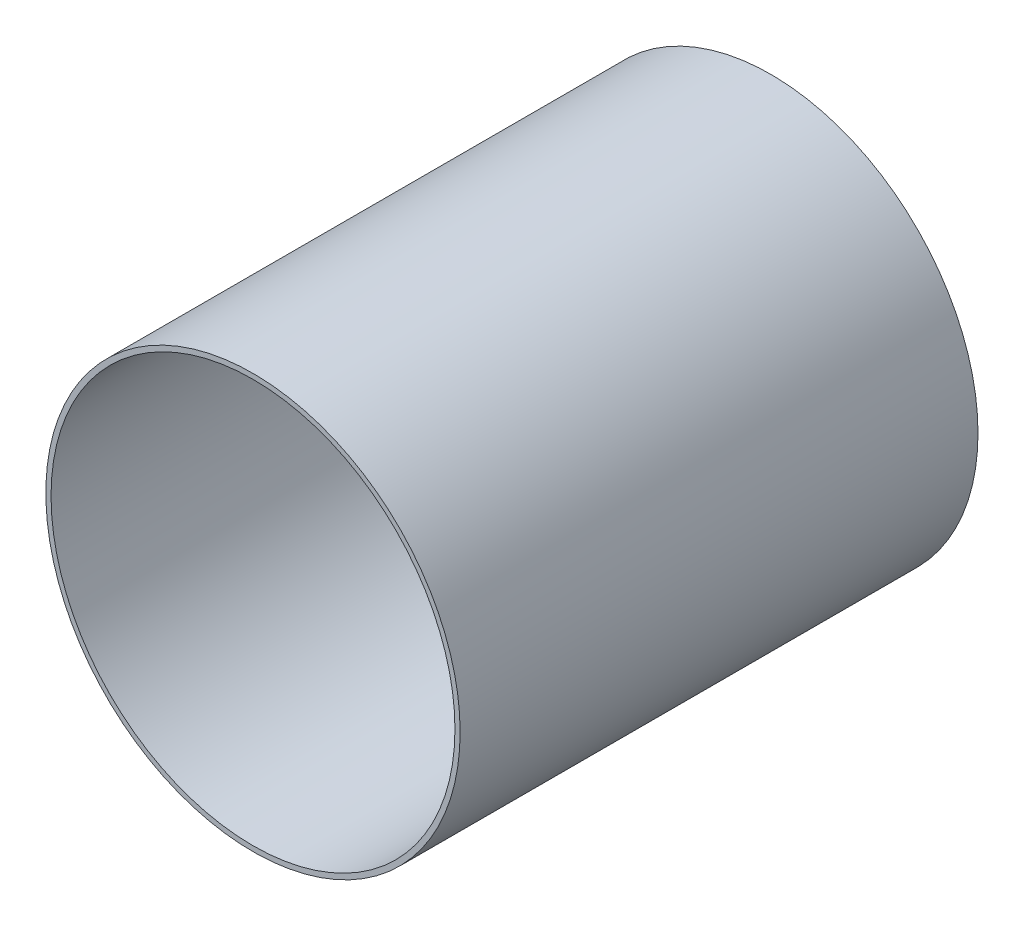
ISO-10303-21;
HEADER;
FILE_DESCRIPTION(('STEP AP214'),'2;1');
FILE_NAME('part.step','',(''),(''),'','','');
FILE_SCHEMA(('AUTOMOTIVE_DESIGN { 1 0 10303 214 1 1 1 1 }'));
ENDSEC;
DATA;
#1=APPLICATION_CONTEXT('core data for automotive mechanical design processes');
#2=APPLICATION_PROTOCOL_DEFINITION('international standard','automotive_design',2000,#1);
#3=PRODUCT_CONTEXT('',#1,'mechanical');
#4=PRODUCT('Part','Part','',(#3));
#5=PRODUCT_RELATED_PRODUCT_CATEGORY('part','',(#4));
#6=PRODUCT_DEFINITION_FORMATION('','',#4);
#7=PRODUCT_DEFINITION_CONTEXT('part definition',#1,'design');
#8=PRODUCT_DEFINITION('design','',#6,#7);
#9=PRODUCT_DEFINITION_SHAPE('','',#8);
#10=(LENGTH_UNIT() NAMED_UNIT(*) SI_UNIT(.MILLI.,.METRE.));
#11=(NAMED_UNIT(*) PLANE_ANGLE_UNIT() SI_UNIT($,.RADIAN.));
#12=(NAMED_UNIT(*) SI_UNIT($,.STERADIAN.) SOLID_ANGLE_UNIT());
#13=UNCERTAINTY_MEASURE_WITH_UNIT(LENGTH_MEASURE(1.E-05),#10,'distance_accuracy_value','');
#14=(GEOMETRIC_REPRESENTATION_CONTEXT(3) GLOBAL_UNCERTAINTY_ASSIGNED_CONTEXT((#13)) GLOBAL_UNIT_ASSIGNED_CONTEXT((#10,
#11,#12)) REPRESENTATION_CONTEXT('',''));
#15=CARTESIAN_POINT('',(0.,0.,0.));
#16=DIRECTION('',(0.,0.,1.));
#17=DIRECTION('',(1.,0.,0.));
#18=AXIS2_PLACEMENT_3D('',#15,#16,#17);
#19=CARTESIAN_POINT('',(0.,0.,254.));
#20=DIRECTION('',(0.,0.,-1.));
#21=DIRECTION('',(-1.,0.,0.));
#22=AXIS2_PLACEMENT_3D('',#19,#20,#21);
#23=CYLINDRICAL_SURFACE('',#22,101.6);
#24=CARTESIAN_POINT('',(0.,0.,254.));
#25=DIRECTION('',(0.,0.,1.));
#26=DIRECTION('',(1.,0.,0.));
#27=AXIS2_PLACEMENT_3D('',#24,#25,#26);
#28=CIRCLE('',#27,101.6);
#29=CARTESIAN_POINT('',(101.6,0.,254.));
#30=VERTEX_POINT('',#29);
#31=EDGE_CURVE('E10',#30,#30,#28,.T.);
#32=ORIENTED_EDGE('',*,*,#31,.F.);
#33=EDGE_LOOP('',(#32));
#34=FACE_BOUND('',#33,.T.);
#35=CARTESIAN_POINT('',(0.,0.,0.));
#36=DIRECTION('',(0.,0.,1.));
#37=DIRECTION('',(1.,0.,0.));
#38=AXIS2_PLACEMENT_3D('',#35,#36,#37);
#39=CIRCLE('',#38,101.6);
#40=CARTESIAN_POINT('',(101.6,0.,0.));
#41=VERTEX_POINT('',#40);
#42=EDGE_CURVE('E33',#41,#41,#39,.T.);
#43=ORIENTED_EDGE('',*,*,#42,.T.);
#44=EDGE_LOOP('',(#43));
#45=FACE_BOUND('',#44,.T.);
#46=ADVANCED_FACE('F30',(#34,#45),#23,.T.);
#47=CARTESIAN_POINT('',(0.,0.,254.));
#48=DIRECTION('',(0.,0.,1.));
#49=DIRECTION('',(1.,0.,0.));
#50=AXIS2_PLACEMENT_3D('',#47,#48,#49);
#51=PLANE('',#50);
#52=CARTESIAN_POINT('',(0.,0.,254.));
#53=DIRECTION('',(0.,0.,1.));
#54=DIRECTION('',(1.,0.,0.));
#55=AXIS2_PLACEMENT_3D('',#52,#53,#54);
#56=CIRCLE('',#55,99.06);
#57=CARTESIAN_POINT('',(99.06,0.,254.));
#58=VERTEX_POINT('',#57);
#59=EDGE_CURVE('E40',#58,#58,#56,.T.);
#60=ORIENTED_EDGE('',*,*,#59,.F.);
#61=EDGE_LOOP('',(#60));
#62=FACE_BOUND('',#61,.T.);
#63=ORIENTED_EDGE('',*,*,#31,.T.);
#64=EDGE_LOOP('',(#63));
#65=FACE_BOUND('',#64,.T.);
#66=ADVANCED_FACE('F71',(#62,#65),#51,.T.);
#67=CARTESIAN_POINT('',(0.,0.,0.));
#68=DIRECTION('',(0.,0.,1.));
#69=DIRECTION('',(1.,0.,0.));
#70=AXIS2_PLACEMENT_3D('',#67,#68,#69);
#71=PLANE('',#70);
#72=CARTESIAN_POINT('',(0.,0.,0.));
#73=DIRECTION('',(0.,0.,1.));
#74=DIRECTION('',(1.,0.,0.));
#75=AXIS2_PLACEMENT_3D('',#72,#73,#74);
#76=CIRCLE('',#75,12.7);
#77=CARTESIAN_POINT('',(12.7,0.,0.));
#78=VERTEX_POINT('',#77);
#79=EDGE_CURVE('E47',#78,#78,#76,.T.);
#80=ORIENTED_EDGE('',*,*,#79,.T.);
#81=EDGE_LOOP('',(#80));
#82=FACE_BOUND('',#81,.T.);
#83=ORIENTED_EDGE('',*,*,#42,.F.);
#84=EDGE_LOOP('',(#83));
#85=FACE_BOUND('',#84,.T.);
#86=ADVANCED_FACE('F65',(#82,#85),#71,.F.);
#87=CARTESIAN_POINT('',(0.,0.,254.));
#88=DIRECTION('',(0.,0.,-1.));
#89=DIRECTION('',(-1.,0.,0.));
#90=AXIS2_PLACEMENT_3D('',#87,#88,#89);
#91=CYLINDRICAL_SURFACE('',#90,99.06);
#92=ORIENTED_EDGE('',*,*,#59,.T.);
#93=EDGE_LOOP('',(#92));
#94=FACE_BOUND('',#93,.T.);
#95=CARTESIAN_POINT('',(0.,0.,2.53999999999999));
#96=DIRECTION('',(0.,0.,1.));
#97=DIRECTION('',(1.,0.,0.));
#98=AXIS2_PLACEMENT_3D('',#95,#96,#97);
#99=CIRCLE('',#98,99.06);
#100=CARTESIAN_POINT('',(99.06,0.,2.53999999999999));
#101=VERTEX_POINT('',#100);
#102=EDGE_CURVE('E44',#101,#101,#99,.T.);
#103=ORIENTED_EDGE('',*,*,#102,.F.);
#104=EDGE_LOOP('',(#103));
#105=FACE_BOUND('',#104,.T.);
#106=ADVANCED_FACE('F60',(#94,#105),#91,.F.);
#107=CARTESIAN_POINT('',(0.,0.,2.54));
#108=DIRECTION('',(0.,0.,1.));
#109=DIRECTION('',(1.,0.,0.));
#110=AXIS2_PLACEMENT_3D('',#107,#108,#109);
#111=PLANE('',#110);
#112=CARTESIAN_POINT('',(0.,0.,2.54));
#113=DIRECTION('',(0.,0.,1.));
#114=DIRECTION('',(1.,0.,0.));
#115=AXIS2_PLACEMENT_3D('',#112,#113,#114);
#116=CIRCLE('',#115,12.7);
#117=CARTESIAN_POINT('',(12.7,0.,2.54));
#118=VERTEX_POINT('',#117);
#119=EDGE_CURVE('E50',#118,#118,#116,.T.);
#120=ORIENTED_EDGE('',*,*,#119,.F.);
#121=EDGE_LOOP('',(#120));
#122=FACE_BOUND('',#121,.T.);
#123=ORIENTED_EDGE('',*,*,#102,.T.);
#124=EDGE_LOOP('',(#123));
#125=FACE_BOUND('',#124,.T.);
#126=ADVANCED_FACE('F57',(#122,#125),#111,.T.);
#127=CARTESIAN_POINT('',(0.,0.,-251.46));
#128=DIRECTION('',(0.,0.,1.));
#129=DIRECTION('',(1.,0.,0.));
#130=AXIS2_PLACEMENT_3D('',#127,#128,#129);
#131=CYLINDRICAL_SURFACE('',#130,12.7);
#132=ORIENTED_EDGE('',*,*,#119,.T.);
#133=EDGE_LOOP('',(#132));
#134=FACE_BOUND('',#133,.T.);
#135=ORIENTED_EDGE('',*,*,#79,.F.);
#136=EDGE_LOOP('',(#135));
#137=FACE_BOUND('',#136,.T.);
#138=ADVANCED_FACE('F54',(#134,#137),#131,.F.);
#139=CLOSED_SHELL('',(#46,#66,#86,#106,#126,#138));
#140=MANIFOLD_SOLID_BREP('B2',#139);
#141=ADVANCED_BREP_SHAPE_REPRESENTATION('',(#18,#140),#14);
#142=SHAPE_DEFINITION_REPRESENTATION(#9,#141);
ENDSEC;
END-ISO-10303-21;
